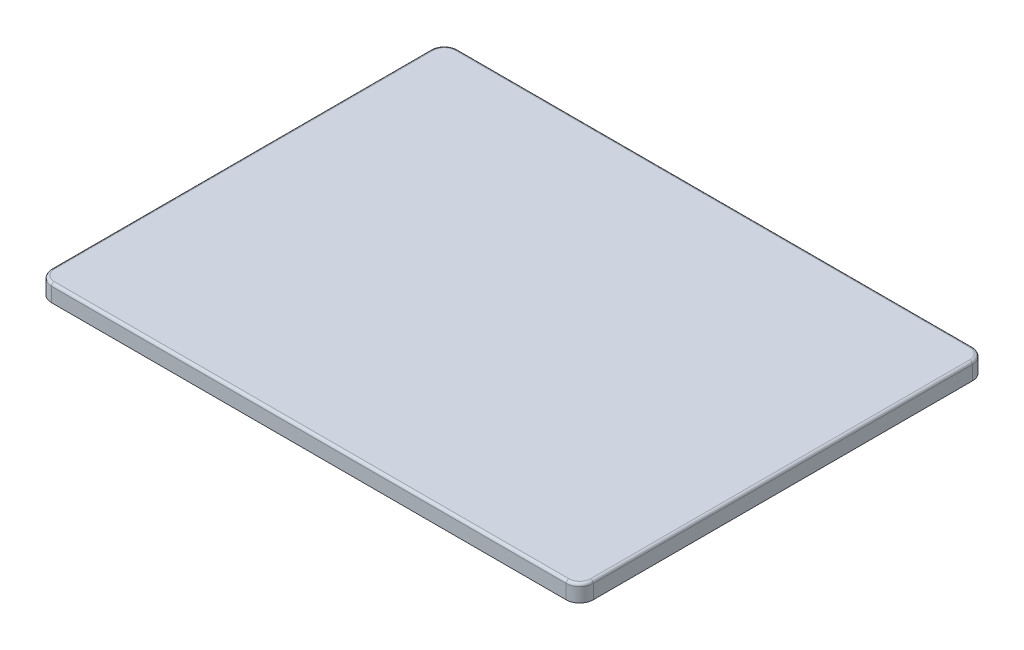
ISO-10303-21;
HEADER;
FILE_DESCRIPTION(('STEP AP214'),'2;1');
FILE_NAME('part.step','',(''),(''),'','','');
FILE_SCHEMA(('AUTOMOTIVE_DESIGN { 1 0 10303 214 1 1 1 1 }'));
ENDSEC;
DATA;
#1=APPLICATION_CONTEXT('core data for automotive mechanical design processes');
#2=APPLICATION_PROTOCOL_DEFINITION('international standard','automotive_design',2000,#1);
#3=PRODUCT_CONTEXT('',#1,'mechanical');
#4=PRODUCT('Part','Part','',(#3));
#5=PRODUCT_RELATED_PRODUCT_CATEGORY('part','',(#4));
#6=PRODUCT_DEFINITION_FORMATION('','',#4);
#7=PRODUCT_DEFINITION_CONTEXT('part definition',#1,'design');
#8=PRODUCT_DEFINITION('design','',#6,#7);
#9=PRODUCT_DEFINITION_SHAPE('','',#8);
#10=(LENGTH_UNIT() NAMED_UNIT(*) SI_UNIT(.MILLI.,.METRE.));
#11=(NAMED_UNIT(*) PLANE_ANGLE_UNIT() SI_UNIT($,.RADIAN.));
#12=(NAMED_UNIT(*) SI_UNIT($,.STERADIAN.) SOLID_ANGLE_UNIT());
#13=UNCERTAINTY_MEASURE_WITH_UNIT(LENGTH_MEASURE(1.E-05),#10,'distance_accuracy_value','');
#14=(GEOMETRIC_REPRESENTATION_CONTEXT(3) GLOBAL_UNCERTAINTY_ASSIGNED_CONTEXT((#13)) GLOBAL_UNIT_ASSIGNED_CONTEXT((#10,
#11,#12)) REPRESENTATION_CONTEXT('',''));
#15=CARTESIAN_POINT('',(0.,0.,0.));
#16=DIRECTION('',(0.,0.,1.));
#17=DIRECTION('',(1.,0.,0.));
#18=AXIS2_PLACEMENT_3D('',#15,#16,#17);
#19=CARTESIAN_POINT('',(25.4,1.5875,-19.05));
#20=DIRECTION('',(-1.,0.,0.));
#21=DIRECTION('',(0.,0.,1.));
#22=AXIS2_PLACEMENT_3D('',#19,#20,#21);
#23=PLANE('',#22);
#24=DIRECTION('',(0.,-1.,0.));
#25=VECTOR('',#24,1.);
#26=CARTESIAN_POINT('',(25.4,1.5875,-17.78));
#27=LINE('',#26,#25);
#28=CARTESIAN_POINT('',(25.4,0.,-17.78));
#29=VERTEX_POINT('',#28);
#30=CARTESIAN_POINT('',(25.4,1.3335,-17.78));
#31=VERTEX_POINT('',#30);
#32=EDGE_CURVE('E128',#29,#31,#27,.F.);
#33=ORIENTED_EDGE('',*,*,#32,.T.);
#34=DIRECTION('',(0.,0.,-1.));
#35=VECTOR('',#34,1.);
#36=CARTESIAN_POINT('',(25.4,1.3335,17.78));
#37=LINE('',#36,#35);
#38=CARTESIAN_POINT('',(25.4,1.3335,17.78));
#39=VERTEX_POINT('',#38);
#40=EDGE_CURVE('E56',#31,#39,#37,.F.);
#41=ORIENTED_EDGE('',*,*,#40,.T.);
#42=DIRECTION('',(0.,-1.,0.));
#43=VECTOR('',#42,1.);
#44=CARTESIAN_POINT('',(25.4,1.5875,17.78));
#45=LINE('',#44,#43);
#46=CARTESIAN_POINT('',(25.4,0.,17.78));
#47=VERTEX_POINT('',#46);
#48=EDGE_CURVE('E121',#39,#47,#45,.T.);
#49=ORIENTED_EDGE('',*,*,#48,.T.);
#50=DIRECTION('',(0.,0.,-1.));
#51=VECTOR('',#50,1.);
#52=CARTESIAN_POINT('',(25.4,0.,-19.05));
#53=LINE('',#52,#51);
#54=EDGE_CURVE('E124',#47,#29,#53,.T.);
#55=ORIENTED_EDGE('',*,*,#54,.T.);
#56=EDGE_LOOP('',(#33,#41,#49,#55));
#57=FACE_BOUND('',#56,.T.);
#58=ADVANCED_FACE('F32',(#57),#23,.F.);
#59=CARTESIAN_POINT('',(-25.4,1.5875,-19.05));
#60=DIRECTION('',(0.,0.,1.));
#61=DIRECTION('',(1.,0.,0.));
#62=AXIS2_PLACEMENT_3D('',#59,#60,#61);
#63=PLANE('',#62);
#64=DIRECTION('',(0.,-1.,0.));
#65=VECTOR('',#64,1.);
#66=CARTESIAN_POINT('',(-24.13,1.5875,-19.05));
#67=LINE('',#66,#65);
#68=CARTESIAN_POINT('',(-24.13,0.,-19.05));
#69=VERTEX_POINT('',#68);
#70=CARTESIAN_POINT('',(-24.13,1.3335,-19.05));
#71=VERTEX_POINT('',#70);
#72=EDGE_CURVE('E161',#69,#71,#67,.F.);
#73=ORIENTED_EDGE('',*,*,#72,.T.);
#74=DIRECTION('',(-1.,0.,0.));
#75=VECTOR('',#74,1.);
#76=CARTESIAN_POINT('',(24.13,1.3335,-19.05));
#77=LINE('',#76,#75);
#78=CARTESIAN_POINT('',(24.13,1.3335,-19.05));
#79=VERTEX_POINT('',#78);
#80=EDGE_CURVE('E195',#71,#79,#77,.F.);
#81=ORIENTED_EDGE('',*,*,#80,.T.);
#82=DIRECTION('',(0.,-1.,0.));
#83=VECTOR('',#82,1.);
#84=CARTESIAN_POINT('',(24.13,1.5875,-19.05));
#85=LINE('',#84,#83);
#86=CARTESIAN_POINT('',(24.13,0.,-19.05));
#87=VERTEX_POINT('',#86);
#88=EDGE_CURVE('E164',#79,#87,#85,.T.);
#89=ORIENTED_EDGE('',*,*,#88,.T.);
#90=DIRECTION('',(-1.,0.,0.));
#91=VECTOR('',#90,1.);
#92=CARTESIAN_POINT('',(-25.4,0.,-19.05));
#93=LINE('',#92,#91);
#94=EDGE_CURVE('E142',#87,#69,#93,.T.);
#95=ORIENTED_EDGE('',*,*,#94,.T.);
#96=EDGE_LOOP('',(#73,#81,#89,#95));
#97=FACE_BOUND('',#96,.T.);
#98=ADVANCED_FACE('F272',(#97),#63,.F.);
#99=CARTESIAN_POINT('',(-25.4,1.5875,-19.05));
#100=DIRECTION('',(1.,0.,0.));
#101=DIRECTION('',(0.,0.,-1.));
#102=AXIS2_PLACEMENT_3D('',#99,#100,#101);
#103=PLANE('',#102);
#104=DIRECTION('',(0.,-1.,0.));
#105=VECTOR('',#104,1.);
#106=CARTESIAN_POINT('',(-25.4,1.5875,17.78));
#107=LINE('',#106,#105);
#108=CARTESIAN_POINT('',(-25.4,0.,17.78));
#109=VERTEX_POINT('',#108);
#110=CARTESIAN_POINT('',(-25.4,1.3335,17.78));
#111=VERTEX_POINT('',#110);
#112=EDGE_CURVE('E166',#109,#111,#107,.F.);
#113=ORIENTED_EDGE('',*,*,#112,.T.);
#114=DIRECTION('',(0.,0.,1.));
#115=VECTOR('',#114,1.);
#116=CARTESIAN_POINT('',(-25.4,1.3335,-17.78));
#117=LINE('',#116,#115);
#118=CARTESIAN_POINT('',(-25.4,1.3335,-17.78));
#119=VERTEX_POINT('',#118);
#120=EDGE_CURVE('E191',#111,#119,#117,.F.);
#121=ORIENTED_EDGE('',*,*,#120,.T.);
#122=DIRECTION('',(0.,-1.,0.));
#123=VECTOR('',#122,1.);
#124=CARTESIAN_POINT('',(-25.4,1.5875,-17.78));
#125=LINE('',#124,#123);
#126=CARTESIAN_POINT('',(-25.4,0.,-17.78));
#127=VERTEX_POINT('',#126);
#128=EDGE_CURVE('E169',#119,#127,#125,.T.);
#129=ORIENTED_EDGE('',*,*,#128,.T.);
#130=DIRECTION('',(0.,0.,1.));
#131=VECTOR('',#130,1.);
#132=CARTESIAN_POINT('',(-25.4,0.,-19.05));
#133=LINE('',#132,#131);
#134=EDGE_CURVE('E145',#127,#109,#133,.T.);
#135=ORIENTED_EDGE('',*,*,#134,.T.);
#136=EDGE_LOOP('',(#113,#121,#129,#135));
#137=FACE_BOUND('',#136,.T.);
#138=ADVANCED_FACE('F257',(#137),#103,.F.);
#139=CARTESIAN_POINT('',(-25.4,1.5875,19.05));
#140=DIRECTION('',(0.,0.,-1.));
#141=DIRECTION('',(-1.,0.,0.));
#142=AXIS2_PLACEMENT_3D('',#139,#140,#141);
#143=PLANE('',#142);
#144=DIRECTION('',(0.,-1.,0.));
#145=VECTOR('',#144,1.);
#146=CARTESIAN_POINT('',(24.13,1.5875,19.05));
#147=LINE('',#146,#145);
#148=CARTESIAN_POINT('',(24.13,0.,19.05));
#149=VERTEX_POINT('',#148);
#150=CARTESIAN_POINT('',(24.13,1.3335,19.05));
#151=VERTEX_POINT('',#150);
#152=EDGE_CURVE('E132',#149,#151,#147,.F.);
#153=ORIENTED_EDGE('',*,*,#152,.T.);
#154=DIRECTION('',(1.,0.,0.));
#155=VECTOR('',#154,1.);
#156=CARTESIAN_POINT('',(-24.13,1.3335,19.05));
#157=LINE('',#156,#155);
#158=CARTESIAN_POINT('',(-24.13,1.3335,19.05));
#159=VERTEX_POINT('',#158);
#160=EDGE_CURVE('E11',#151,#159,#157,.F.);
#161=ORIENTED_EDGE('',*,*,#160,.T.);
#162=DIRECTION('',(0.,-1.,0.));
#163=VECTOR('',#162,1.);
#164=CARTESIAN_POINT('',(-24.13,1.5875,19.05));
#165=LINE('',#164,#163);
#166=CARTESIAN_POINT('',(-24.13,0.,19.05));
#167=VERTEX_POINT('',#166);
#168=EDGE_CURVE('E136',#159,#167,#165,.T.);
#169=ORIENTED_EDGE('',*,*,#168,.T.);
#170=DIRECTION('',(1.,0.,0.));
#171=VECTOR('',#170,1.);
#172=CARTESIAN_POINT('',(-25.4,0.,19.05));
#173=LINE('',#172,#171);
#174=EDGE_CURVE('E152',#167,#149,#173,.T.);
#175=ORIENTED_EDGE('',*,*,#174,.T.);
#176=EDGE_LOOP('',(#153,#161,#169,#175));
#177=FACE_BOUND('',#176,.T.);
#178=ADVANCED_FACE('F240',(#177),#143,.F.);
#179=CARTESIAN_POINT('',(0.,1.5875,0.));
#180=DIRECTION('',(0.,1.,0.));
#181=DIRECTION('',(0.,0.,1.));
#182=AXIS2_PLACEMENT_3D('',#179,#180,#181);
#183=PLANE('',#182);
#184=DIRECTION('',(0.,0.,1.));
#185=VECTOR('',#184,1.);
#186=CARTESIAN_POINT('',(-25.146,1.5875,17.78));
#187=LINE('',#186,#185);
#188=CARTESIAN_POINT('',(-25.146,1.5875,-17.78));
#189=VERTEX_POINT('',#188);
#190=CARTESIAN_POINT('',(-25.146,1.5875,17.78));
#191=VERTEX_POINT('',#190);
#192=EDGE_CURVE('E183',#189,#191,#187,.T.);
#193=ORIENTED_EDGE('',*,*,#192,.T.);
#194=CARTESIAN_POINT('',(-24.13,1.5875,17.78));
#195=DIRECTION('',(0.,1.,0.));
#196=DIRECTION('',(0.,0.,1.));
#197=AXIS2_PLACEMENT_3D('',#194,#195,#196);
#198=CIRCLE('',#197,1.016);
#199=CARTESIAN_POINT('',(-24.13,1.5875,18.796));
#200=VERTEX_POINT('',#199);
#201=EDGE_CURVE('E185',#191,#200,#198,.T.);
#202=ORIENTED_EDGE('',*,*,#201,.T.);
#203=DIRECTION('',(1.,0.,0.));
#204=VECTOR('',#203,1.);
#205=CARTESIAN_POINT('',(24.13,1.5875,18.796));
#206=LINE('',#205,#204);
#207=CARTESIAN_POINT('',(24.13,1.5875,18.796));
#208=VERTEX_POINT('',#207);
#209=EDGE_CURVE('E171',#200,#208,#206,.T.);
#210=ORIENTED_EDGE('',*,*,#209,.T.);
#211=CARTESIAN_POINT('',(24.13,1.5875,17.78));
#212=DIRECTION('',(0.,1.,0.));
#213=DIRECTION('',(0.,0.,1.));
#214=AXIS2_PLACEMENT_3D('',#211,#212,#213);
#215=CIRCLE('',#214,1.016);
#216=CARTESIAN_POINT('',(25.146,1.5875,17.78));
#217=VERTEX_POINT('',#216);
#218=EDGE_CURVE('E173',#208,#217,#215,.T.);
#219=ORIENTED_EDGE('',*,*,#218,.T.);
#220=DIRECTION('',(0.,0.,-1.));
#221=VECTOR('',#220,1.);
#222=CARTESIAN_POINT('',(25.146,1.5875,-17.78));
#223=LINE('',#222,#221);
#224=CARTESIAN_POINT('',(25.146,1.5875,-17.78));
#225=VERTEX_POINT('',#224);
#226=EDGE_CURVE('E175',#217,#225,#223,.T.);
#227=ORIENTED_EDGE('',*,*,#226,.T.);
#228=CARTESIAN_POINT('',(24.13,1.5875,-17.78));
#229=DIRECTION('',(0.,1.,0.));
#230=DIRECTION('',(0.,0.,1.));
#231=AXIS2_PLACEMENT_3D('',#228,#229,#230);
#232=CIRCLE('',#231,1.016);
#233=CARTESIAN_POINT('',(24.13,1.5875,-18.796));
#234=VERTEX_POINT('',#233);
#235=EDGE_CURVE('E177',#225,#234,#232,.T.);
#236=ORIENTED_EDGE('',*,*,#235,.T.);
#237=DIRECTION('',(-1.,0.,0.));
#238=VECTOR('',#237,1.);
#239=CARTESIAN_POINT('',(-24.13,1.5875,-18.796));
#240=LINE('',#239,#238);
#241=CARTESIAN_POINT('',(-24.13,1.5875,-18.796));
#242=VERTEX_POINT('',#241);
#243=EDGE_CURVE('E179',#234,#242,#240,.T.);
#244=ORIENTED_EDGE('',*,*,#243,.T.);
#245=CARTESIAN_POINT('',(-24.13,1.5875,-17.78));
#246=DIRECTION('',(0.,1.,0.));
#247=DIRECTION('',(0.,0.,1.));
#248=AXIS2_PLACEMENT_3D('',#245,#246,#247);
#249=CIRCLE('',#248,1.016);
#250=EDGE_CURVE('E181',#242,#189,#249,.T.);
#251=ORIENTED_EDGE('',*,*,#250,.T.);
#252=EDGE_LOOP('',(#193,#202,#210,#219,#227,#236,#244,#251));
#253=FACE_BOUND('',#252,.T.);
#254=ADVANCED_FACE('F227',(#253),#183,.T.);
#255=CARTESIAN_POINT('',(0.,0.,0.));
#256=DIRECTION('',(0.,1.,0.));
#257=DIRECTION('',(0.,0.,1.));
#258=AXIS2_PLACEMENT_3D('',#255,#256,#257);
#259=PLANE('',#258);
#260=ORIENTED_EDGE('',*,*,#54,.F.);
#261=CARTESIAN_POINT('',(24.13,0.,17.78));
#262=DIRECTION('',(0.,1.,0.));
#263=DIRECTION('',(0.,0.,1.));
#264=AXIS2_PLACEMENT_3D('',#261,#262,#263);
#265=CIRCLE('',#264,1.27);
#266=EDGE_CURVE('E130',#47,#149,#265,.F.);
#267=ORIENTED_EDGE('',*,*,#266,.T.);
#268=ORIENTED_EDGE('',*,*,#174,.F.);
#269=CARTESIAN_POINT('',(-24.13,0.,17.78));
#270=DIRECTION('',(0.,1.,0.));
#271=DIRECTION('',(0.,0.,1.));
#272=AXIS2_PLACEMENT_3D('',#269,#270,#271);
#273=CIRCLE('',#272,1.27);
#274=EDGE_CURVE('E127',#167,#109,#273,.F.);
#275=ORIENTED_EDGE('',*,*,#274,.T.);
#276=ORIENTED_EDGE('',*,*,#134,.F.);
#277=CARTESIAN_POINT('',(-24.13,0.,-17.78));
#278=DIRECTION('',(0.,1.,0.));
#279=DIRECTION('',(0.,0.,1.));
#280=AXIS2_PLACEMENT_3D('',#277,#278,#279);
#281=CIRCLE('',#280,1.27);
#282=EDGE_CURVE('E156',#127,#69,#281,.F.);
#283=ORIENTED_EDGE('',*,*,#282,.T.);
#284=ORIENTED_EDGE('',*,*,#94,.F.);
#285=CARTESIAN_POINT('',(24.13,0.,-17.78));
#286=DIRECTION('',(0.,1.,0.));
#287=DIRECTION('',(0.,0.,1.));
#288=AXIS2_PLACEMENT_3D('',#285,#286,#287);
#289=CIRCLE('',#288,1.27);
#290=EDGE_CURVE('E137',#87,#29,#289,.F.);
#291=ORIENTED_EDGE('',*,*,#290,.T.);
#292=EDGE_LOOP('',(#260,#267,#268,#275,#276,#283,#284,#291));
#293=FACE_BOUND('',#292,.T.);
#294=ADVANCED_FACE('F139',(#293),#259,.F.);
#295=CARTESIAN_POINT('',(24.13,1.5875,17.78));
#296=DIRECTION('',(0.,-1.,0.));
#297=DIRECTION('',(0.,0.,-1.));
#298=AXIS2_PLACEMENT_3D('',#295,#296,#297);
#299=CYLINDRICAL_SURFACE('',#298,1.27);
#300=ORIENTED_EDGE('',*,*,#48,.F.);
#301=CARTESIAN_POINT('',(24.13,1.3335,17.78));
#302=DIRECTION('',(0.,1.,0.));
#303=DIRECTION('',(0.,0.,1.));
#304=AXIS2_PLACEMENT_3D('',#301,#302,#303);
#305=CIRCLE('',#304,1.27);
#306=EDGE_CURVE('E41',#39,#151,#305,.F.);
#307=ORIENTED_EDGE('',*,*,#306,.T.);
#308=ORIENTED_EDGE('',*,*,#152,.F.);
#309=ORIENTED_EDGE('',*,*,#266,.F.);
#310=EDGE_LOOP('',(#300,#307,#308,#309));
#311=FACE_BOUND('',#310,.T.);
#312=ADVANCED_FACE('F131',(#311),#299,.T.);
#313=CARTESIAN_POINT('',(24.13,1.5875,-17.78));
#314=DIRECTION('',(0.,-1.,0.));
#315=DIRECTION('',(0.,0.,-1.));
#316=AXIS2_PLACEMENT_3D('',#313,#314,#315);
#317=CYLINDRICAL_SURFACE('',#316,1.27);
#318=ORIENTED_EDGE('',*,*,#88,.F.);
#319=CARTESIAN_POINT('',(24.13,1.3335,-17.78));
#320=DIRECTION('',(0.,1.,0.));
#321=DIRECTION('',(0.,0.,1.));
#322=AXIS2_PLACEMENT_3D('',#319,#320,#321);
#323=CIRCLE('',#322,1.27);
#324=EDGE_CURVE('E197',#79,#31,#323,.F.);
#325=ORIENTED_EDGE('',*,*,#324,.T.);
#326=ORIENTED_EDGE('',*,*,#32,.F.);
#327=ORIENTED_EDGE('',*,*,#290,.F.);
#328=EDGE_LOOP('',(#318,#325,#326,#327));
#329=FACE_BOUND('',#328,.T.);
#330=ADVANCED_FACE('F274',(#329),#317,.T.);
#331=CARTESIAN_POINT('',(-24.13,1.5875,-17.78));
#332=DIRECTION('',(0.,-1.,0.));
#333=DIRECTION('',(0.,0.,-1.));
#334=AXIS2_PLACEMENT_3D('',#331,#332,#333);
#335=CYLINDRICAL_SURFACE('',#334,1.27);
#336=ORIENTED_EDGE('',*,*,#128,.F.);
#337=CARTESIAN_POINT('',(-24.13,1.3335,-17.78));
#338=DIRECTION('',(0.,1.,0.));
#339=DIRECTION('',(0.,0.,1.));
#340=AXIS2_PLACEMENT_3D('',#337,#338,#339);
#341=CIRCLE('',#340,1.27);
#342=EDGE_CURVE('E193',#119,#71,#341,.F.);
#343=ORIENTED_EDGE('',*,*,#342,.T.);
#344=ORIENTED_EDGE('',*,*,#72,.F.);
#345=ORIENTED_EDGE('',*,*,#282,.F.);
#346=EDGE_LOOP('',(#336,#343,#344,#345));
#347=FACE_BOUND('',#346,.T.);
#348=ADVANCED_FACE('F261',(#347),#335,.T.);
#349=CARTESIAN_POINT('',(-24.13,1.5875,17.78));
#350=DIRECTION('',(0.,-1.,0.));
#351=DIRECTION('',(0.,0.,-1.));
#352=AXIS2_PLACEMENT_3D('',#349,#350,#351);
#353=CYLINDRICAL_SURFACE('',#352,1.27);
#354=ORIENTED_EDGE('',*,*,#168,.F.);
#355=CARTESIAN_POINT('',(-24.13,1.3335,17.78));
#356=DIRECTION('',(0.,1.,0.));
#357=DIRECTION('',(0.,0.,1.));
#358=AXIS2_PLACEMENT_3D('',#355,#356,#357);
#359=CIRCLE('',#358,1.27);
#360=EDGE_CURVE('E188',#159,#111,#359,.F.);
#361=ORIENTED_EDGE('',*,*,#360,.T.);
#362=ORIENTED_EDGE('',*,*,#112,.F.);
#363=ORIENTED_EDGE('',*,*,#274,.F.);
#364=EDGE_LOOP('',(#354,#361,#362,#363));
#365=FACE_BOUND('',#364,.T.);
#366=ADVANCED_FACE('F244',(#365),#353,.T.);
#367=CARTESIAN_POINT('',(24.13,1.3335,-17.78));
#368=DIRECTION('',(0.,1.,0.));
#369=DIRECTION('',(0.,0.,1.));
#370=AXIS2_PLACEMENT_3D('',#367,#368,#369);
#371=TOROIDAL_SURFACE('',#370,1.016,0.254);
#372=CARTESIAN_POINT('',(25.146,1.3335,-17.78));
#373=DIRECTION('',(0.,0.,1.));
#374=DIRECTION('',(1.,0.,0.));
#375=AXIS2_PLACEMENT_3D('',#372,#373,#374);
#376=CIRCLE('',#375,0.254);
#377=EDGE_CURVE('E148',#31,#225,#376,.T.);
#378=ORIENTED_EDGE('',*,*,#377,.F.);
#379=ORIENTED_EDGE('',*,*,#324,.F.);
#380=CARTESIAN_POINT('',(24.13,1.3335,-18.796));
#381=DIRECTION('',(-1.,0.,0.));
#382=DIRECTION('',(0.,0.,1.));
#383=AXIS2_PLACEMENT_3D('',#380,#381,#382);
#384=CIRCLE('',#383,0.254);
#385=EDGE_CURVE('E36',#234,#79,#384,.T.);
#386=ORIENTED_EDGE('',*,*,#385,.F.);
#387=ORIENTED_EDGE('',*,*,#235,.F.);
#388=EDGE_LOOP('',(#378,#379,#386,#387));
#389=FACE_BOUND('',#388,.T.);
#390=ADVANCED_FACE('F34',(#389),#371,.T.);
#391=CARTESIAN_POINT('',(0.,1.3335,-18.796));
#392=DIRECTION('',(1.,0.,0.));
#393=DIRECTION('',(0.,0.,-1.));
#394=AXIS2_PLACEMENT_3D('',#391,#392,#393);
#395=CYLINDRICAL_SURFACE('',#394,0.254);
#396=ORIENTED_EDGE('',*,*,#385,.T.);
#397=ORIENTED_EDGE('',*,*,#80,.F.);
#398=CARTESIAN_POINT('',(-24.13,1.3335,-18.796));
#399=DIRECTION('',(-1.,0.,0.));
#400=DIRECTION('',(0.,0.,1.));
#401=AXIS2_PLACEMENT_3D('',#398,#399,#400);
#402=CIRCLE('',#401,0.254);
#403=EDGE_CURVE('E214',#242,#71,#402,.T.);
#404=ORIENTED_EDGE('',*,*,#403,.F.);
#405=ORIENTED_EDGE('',*,*,#243,.F.);
#406=EDGE_LOOP('',(#396,#397,#404,#405));
#407=FACE_BOUND('',#406,.T.);
#408=ADVANCED_FACE('F269',(#407),#395,.T.);
#409=CARTESIAN_POINT('',(25.146,1.3335,0.));
#410=DIRECTION('',(0.,0.,1.));
#411=DIRECTION('',(1.,0.,0.));
#412=AXIS2_PLACEMENT_3D('',#409,#410,#411);
#413=CYLINDRICAL_SURFACE('',#412,0.254);
#414=ORIENTED_EDGE('',*,*,#377,.T.);
#415=ORIENTED_EDGE('',*,*,#226,.F.);
#416=CARTESIAN_POINT('',(25.146,1.3335,17.78));
#417=DIRECTION('',(0.,0.,1.));
#418=DIRECTION('',(1.,0.,0.));
#419=AXIS2_PLACEMENT_3D('',#416,#417,#418);
#420=CIRCLE('',#419,0.254);
#421=EDGE_CURVE('E211',#39,#217,#420,.T.);
#422=ORIENTED_EDGE('',*,*,#421,.F.);
#423=ORIENTED_EDGE('',*,*,#40,.F.);
#424=EDGE_LOOP('',(#414,#415,#422,#423));
#425=FACE_BOUND('',#424,.T.);
#426=ADVANCED_FACE('F220',(#425),#413,.T.);
#427=CARTESIAN_POINT('',(-24.13,1.3335,-17.78));
#428=DIRECTION('',(0.,1.,0.));
#429=DIRECTION('',(0.,0.,1.));
#430=AXIS2_PLACEMENT_3D('',#427,#428,#429);
#431=TOROIDAL_SURFACE('',#430,1.016,0.254);
#432=ORIENTED_EDGE('',*,*,#403,.T.);
#433=ORIENTED_EDGE('',*,*,#342,.F.);
#434=CARTESIAN_POINT('',(-25.146,1.3335,-17.78));
#435=DIRECTION('',(0.,0.,1.));
#436=DIRECTION('',(1.,0.,0.));
#437=AXIS2_PLACEMENT_3D('',#434,#435,#436);
#438=CIRCLE('',#437,0.254);
#439=EDGE_CURVE('E208',#189,#119,#438,.T.);
#440=ORIENTED_EDGE('',*,*,#439,.F.);
#441=ORIENTED_EDGE('',*,*,#250,.F.);
#442=EDGE_LOOP('',(#432,#433,#440,#441));
#443=FACE_BOUND('',#442,.T.);
#444=ADVANCED_FACE('F265',(#443),#431,.T.);
#445=CARTESIAN_POINT('',(24.13,1.3335,17.78));
#446=DIRECTION('',(0.,1.,0.));
#447=DIRECTION('',(0.,0.,1.));
#448=AXIS2_PLACEMENT_3D('',#445,#446,#447);
#449=TOROIDAL_SURFACE('',#448,1.016,0.254);
#450=ORIENTED_EDGE('',*,*,#421,.T.);
#451=ORIENTED_EDGE('',*,*,#218,.F.);
#452=CARTESIAN_POINT('',(24.13,1.3335,18.796));
#453=DIRECTION('',(-1.,0.,0.));
#454=DIRECTION('',(0.,0.,1.));
#455=AXIS2_PLACEMENT_3D('',#452,#453,#454);
#456=CIRCLE('',#455,0.254);
#457=EDGE_CURVE('E205',#151,#208,#456,.T.);
#458=ORIENTED_EDGE('',*,*,#457,.F.);
#459=ORIENTED_EDGE('',*,*,#306,.F.);
#460=EDGE_LOOP('',(#450,#451,#458,#459));
#461=FACE_BOUND('',#460,.T.);
#462=ADVANCED_FACE('F233',(#461),#449,.T.);
#463=CARTESIAN_POINT('',(-25.146,1.3335,0.));
#464=DIRECTION('',(0.,0.,-1.));
#465=DIRECTION('',(-1.,0.,0.));
#466=AXIS2_PLACEMENT_3D('',#463,#464,#465);
#467=CYLINDRICAL_SURFACE('',#466,0.254);
#468=ORIENTED_EDGE('',*,*,#439,.T.);
#469=ORIENTED_EDGE('',*,*,#120,.F.);
#470=CARTESIAN_POINT('',(-25.146,1.3335,17.78));
#471=DIRECTION('',(0.,0.,1.));
#472=DIRECTION('',(1.,0.,0.));
#473=AXIS2_PLACEMENT_3D('',#470,#471,#472);
#474=CIRCLE('',#473,0.254);
#475=EDGE_CURVE('E203',#191,#111,#474,.T.);
#476=ORIENTED_EDGE('',*,*,#475,.F.);
#477=ORIENTED_EDGE('',*,*,#192,.F.);
#478=EDGE_LOOP('',(#468,#469,#476,#477));
#479=FACE_BOUND('',#478,.T.);
#480=ADVANCED_FACE('F253',(#479),#467,.T.);
#481=CARTESIAN_POINT('',(0.,1.3335,18.796));
#482=DIRECTION('',(-1.,0.,0.));
#483=DIRECTION('',(0.,0.,1.));
#484=AXIS2_PLACEMENT_3D('',#481,#482,#483);
#485=CYLINDRICAL_SURFACE('',#484,0.254);
#486=ORIENTED_EDGE('',*,*,#457,.T.);
#487=ORIENTED_EDGE('',*,*,#209,.F.);
#488=CARTESIAN_POINT('',(-24.13,1.3335,18.796));
#489=DIRECTION('',(-1.,0.,0.));
#490=DIRECTION('',(0.,0.,1.));
#491=AXIS2_PLACEMENT_3D('',#488,#489,#490);
#492=CIRCLE('',#491,0.254);
#493=EDGE_CURVE('E201',#159,#200,#492,.T.);
#494=ORIENTED_EDGE('',*,*,#493,.F.);
#495=ORIENTED_EDGE('',*,*,#160,.F.);
#496=EDGE_LOOP('',(#486,#487,#494,#495));
#497=FACE_BOUND('',#496,.T.);
#498=ADVANCED_FACE('F236',(#497),#485,.T.);
#499=CARTESIAN_POINT('',(-24.13,1.3335,17.78));
#500=DIRECTION('',(0.,1.,0.));
#501=DIRECTION('',(0.,0.,1.));
#502=AXIS2_PLACEMENT_3D('',#499,#500,#501);
#503=TOROIDAL_SURFACE('',#502,1.016,0.254);
#504=ORIENTED_EDGE('',*,*,#475,.T.);
#505=ORIENTED_EDGE('',*,*,#360,.F.);
#506=ORIENTED_EDGE('',*,*,#493,.T.);
#507=ORIENTED_EDGE('',*,*,#201,.F.);
#508=EDGE_LOOP('',(#504,#505,#506,#507));
#509=FACE_BOUND('',#508,.T.);
#510=ADVANCED_FACE('F247',(#509),#503,.T.);
#511=CLOSED_SHELL('',(#58,#98,#138,#178,#254,#294,#312,#330,#348,#366,#390,#408,#426,#444,#462,
#480,#498,#510));
#512=MANIFOLD_SOLID_BREP('B2',#511);
#513=ADVANCED_BREP_SHAPE_REPRESENTATION('',(#18,#512),#14);
#514=SHAPE_DEFINITION_REPRESENTATION(#9,#513);
ENDSEC;
END-ISO-10303-21;
